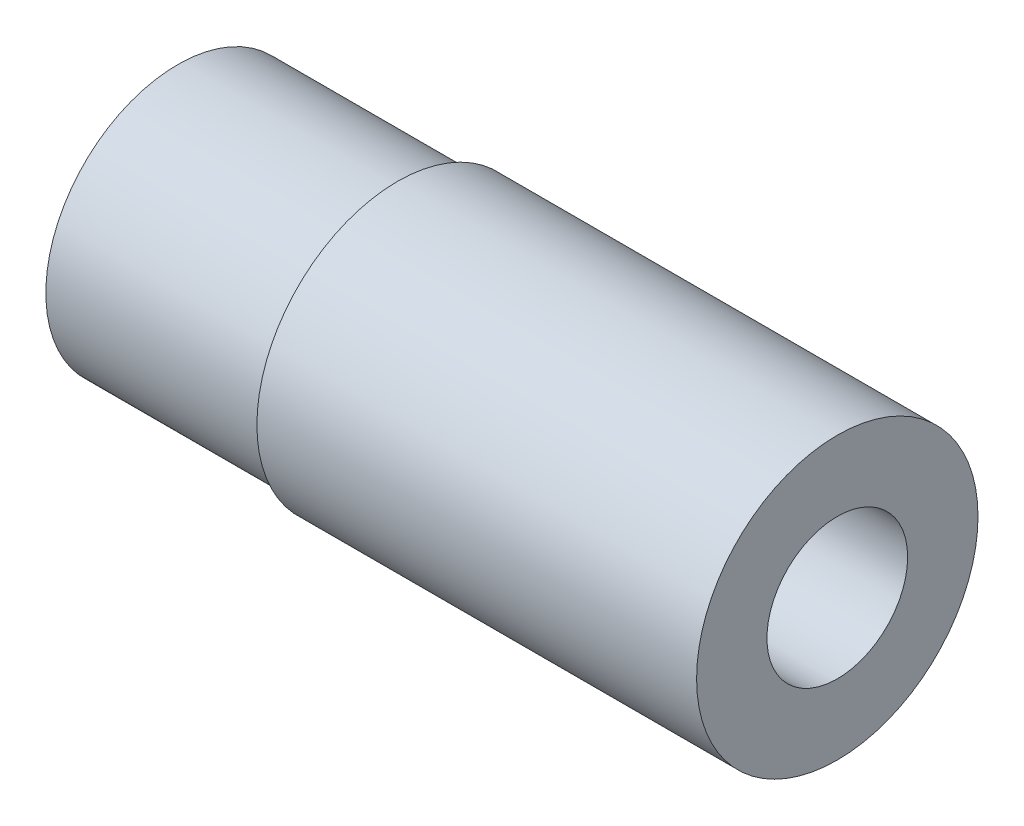
ISO-10303-21;
HEADER;
FILE_DESCRIPTION(('STEP AP214'),'2;1');
FILE_NAME('part.step','',(''),(''),'','','');
FILE_SCHEMA(('AUTOMOTIVE_DESIGN { 1 0 10303 214 1 1 1 1 }'));
ENDSEC;
DATA;
#1=APPLICATION_CONTEXT('core data for automotive mechanical design processes');
#2=APPLICATION_PROTOCOL_DEFINITION('international standard','automotive_design',2000,#1);
#3=PRODUCT_CONTEXT('',#1,'mechanical');
#4=PRODUCT('Part','Part','',(#3));
#5=PRODUCT_RELATED_PRODUCT_CATEGORY('part','',(#4));
#6=PRODUCT_DEFINITION_FORMATION('','',#4);
#7=PRODUCT_DEFINITION_CONTEXT('part definition',#1,'design');
#8=PRODUCT_DEFINITION('design','',#6,#7);
#9=PRODUCT_DEFINITION_SHAPE('','',#8);
#10=(LENGTH_UNIT() NAMED_UNIT(*) SI_UNIT(.MILLI.,.METRE.));
#11=(NAMED_UNIT(*) PLANE_ANGLE_UNIT() SI_UNIT($,.RADIAN.));
#12=(NAMED_UNIT(*) SI_UNIT($,.STERADIAN.) SOLID_ANGLE_UNIT());
#13=UNCERTAINTY_MEASURE_WITH_UNIT(LENGTH_MEASURE(1.E-05),#10,'distance_accuracy_value','');
#14=(GEOMETRIC_REPRESENTATION_CONTEXT(3) GLOBAL_UNCERTAINTY_ASSIGNED_CONTEXT((#13)) GLOBAL_UNIT_ASSIGNED_CONTEXT((#10,
#11,#12)) REPRESENTATION_CONTEXT('',''));
#15=CARTESIAN_POINT('',(0.,0.,0.));
#16=DIRECTION('',(0.,0.,1.));
#17=DIRECTION('',(1.,0.,0.));
#18=AXIS2_PLACEMENT_3D('',#15,#16,#17);
#19=CARTESIAN_POINT('',(0.,0.,0.));
#20=DIRECTION('',(1.,0.,0.));
#21=DIRECTION('',(0.,0.,-1.));
#22=AXIS2_PLACEMENT_3D('',#19,#20,#21);
#23=PLANE('',#22);
#24=CARTESIAN_POINT('',(0.,0.,0.));
#25=DIRECTION('',(1.,0.,0.));
#26=DIRECTION('',(0.,0.,-1.));
#27=AXIS2_PLACEMENT_3D('',#24,#25,#26);
#28=CIRCLE('',#27,15.);
#29=CARTESIAN_POINT('',(0.,0.,-15.));
#30=VERTEX_POINT('',#29);
#31=EDGE_CURVE('E41',#30,#30,#28,.T.);
#32=ORIENTED_EDGE('',*,*,#31,.F.);
#33=EDGE_LOOP('',(#32));
#34=FACE_BOUND('',#33,.T.);
#35=CARTESIAN_POINT('',(0.,0.,0.));
#36=DIRECTION('',(1.,0.,0.));
#37=DIRECTION('',(0.,0.,-1.));
#38=AXIS2_PLACEMENT_3D('',#35,#36,#37);
#39=CIRCLE('',#38,12.);
#40=CARTESIAN_POINT('',(0.,0.,-12.));
#41=VERTEX_POINT('',#40);
#42=EDGE_CURVE('E50',#41,#41,#39,.T.);
#43=ORIENTED_EDGE('',*,*,#42,.T.);
#44=EDGE_LOOP('',(#43));
#45=FACE_BOUND('',#44,.T.);
#46=ADVANCED_FACE('F37',(#34,#45),#23,.F.);
#47=CARTESIAN_POINT('',(25.,0.,0.));
#48=DIRECTION('',(-1.,0.,0.));
#49=DIRECTION('',(0.,0.,1.));
#50=AXIS2_PLACEMENT_3D('',#47,#48,#49);
#51=CYLINDRICAL_SURFACE('',#50,15.);
#52=CARTESIAN_POINT('',(25.,0.,0.));
#53=DIRECTION('',(1.,0.,0.));
#54=DIRECTION('',(0.,0.,-1.));
#55=AXIS2_PLACEMENT_3D('',#52,#53,#54);
#56=CIRCLE('',#55,15.);
#57=CARTESIAN_POINT('',(25.,0.,-15.));
#58=VERTEX_POINT('',#57);
#59=EDGE_CURVE('E10',#58,#58,#56,.T.);
#60=ORIENTED_EDGE('',*,*,#59,.F.);
#61=EDGE_LOOP('',(#60));
#62=FACE_BOUND('',#61,.T.);
#63=ORIENTED_EDGE('',*,*,#31,.T.);
#64=EDGE_LOOP('',(#63));
#65=FACE_BOUND('',#64,.T.);
#66=ADVANCED_FACE('F39',(#62,#65),#51,.T.);
#67=CARTESIAN_POINT('',(25.,0.,0.));
#68=DIRECTION('',(-1.,0.,0.));
#69=DIRECTION('',(0.,0.,1.));
#70=AXIS2_PLACEMENT_3D('',#67,#68,#69);
#71=CYLINDRICAL_SURFACE('',#70,12.);
#72=CARTESIAN_POINT('',(25.,0.,0.));
#73=DIRECTION('',(1.,0.,0.));
#74=DIRECTION('',(0.,0.,-1.));
#75=AXIS2_PLACEMENT_3D('',#72,#73,#74);
#76=CIRCLE('',#75,12.);
#77=CARTESIAN_POINT('',(25.,0.,-12.));
#78=VERTEX_POINT('',#77);
#79=EDGE_CURVE('E55',#78,#78,#76,.T.);
#80=ORIENTED_EDGE('',*,*,#79,.T.);
#81=EDGE_LOOP('',(#80));
#82=FACE_BOUND('',#81,.T.);
#83=ORIENTED_EDGE('',*,*,#42,.F.);
#84=EDGE_LOOP('',(#83));
#85=FACE_BOUND('',#84,.T.);
#86=ADVANCED_FACE('F91',(#82,#85),#71,.F.);
#87=CARTESIAN_POINT('',(25.,0.,0.));
#88=DIRECTION('',(1.,0.,0.));
#89=DIRECTION('',(0.,0.,-1.));
#90=AXIS2_PLACEMENT_3D('',#87,#88,#89);
#91=PLANE('',#90);
#92=CARTESIAN_POINT('',(25.,0.,0.));
#93=DIRECTION('',(1.,0.,0.));
#94=DIRECTION('',(0.,0.,-1.));
#95=AXIS2_PLACEMENT_3D('',#92,#93,#94);
#96=CIRCLE('',#95,8.);
#97=CARTESIAN_POINT('',(25.,0.,-8.));
#98=VERTEX_POINT('',#97);
#99=EDGE_CURVE('E68',#98,#98,#96,.T.);
#100=ORIENTED_EDGE('',*,*,#99,.T.);
#101=EDGE_LOOP('',(#100));
#102=FACE_BOUND('',#101,.T.);
#103=ORIENTED_EDGE('',*,*,#79,.F.);
#104=EDGE_LOOP('',(#103));
#105=FACE_BOUND('',#104,.T.);
#106=ADVANCED_FACE('F82',(#102,#105),#91,.F.);
#107=CARTESIAN_POINT('',(75.,0.,0.));
#108=DIRECTION('',(1.,0.,0.));
#109=DIRECTION('',(0.,0.,-1.));
#110=AXIS2_PLACEMENT_3D('',#107,#108,#109);
#111=PLANE('',#110);
#112=CARTESIAN_POINT('',(75.,0.,0.));
#113=DIRECTION('',(1.,0.,0.));
#114=DIRECTION('',(0.,0.,-1.));
#115=AXIS2_PLACEMENT_3D('',#112,#113,#114);
#116=CIRCLE('',#115,16.);
#117=CARTESIAN_POINT('',(75.,0.,-16.));
#118=VERTEX_POINT('',#117);
#119=EDGE_CURVE('E59',#118,#118,#116,.T.);
#120=ORIENTED_EDGE('',*,*,#119,.T.);
#121=EDGE_LOOP('',(#120));
#122=FACE_BOUND('',#121,.T.);
#123=CARTESIAN_POINT('',(75.,0.,0.));
#124=DIRECTION('',(1.,0.,0.));
#125=DIRECTION('',(0.,0.,-1.));
#126=AXIS2_PLACEMENT_3D('',#123,#124,#125);
#127=CIRCLE('',#126,8.);
#128=CARTESIAN_POINT('',(75.,0.,-8.));
#129=VERTEX_POINT('',#128);
#130=EDGE_CURVE('E64',#129,#129,#127,.T.);
#131=ORIENTED_EDGE('',*,*,#130,.F.);
#132=EDGE_LOOP('',(#131));
#133=FACE_BOUND('',#132,.T.);
#134=ADVANCED_FACE('F79',(#122,#133),#111,.T.);
#135=ORIENTED_EDGE('',*,*,#59,.T.);
#136=EDGE_LOOP('',(#135));
#137=FACE_BOUND('',#136,.T.);
#138=CARTESIAN_POINT('',(25.,0.,0.));
#139=DIRECTION('',(1.,0.,0.));
#140=DIRECTION('',(0.,0.,-1.));
#141=AXIS2_PLACEMENT_3D('',#138,#139,#140);
#142=CIRCLE('',#141,16.);
#143=CARTESIAN_POINT('',(25.,0.,-16.));
#144=VERTEX_POINT('',#143);
#145=EDGE_CURVE('E60',#144,#144,#142,.T.);
#146=ORIENTED_EDGE('',*,*,#145,.F.);
#147=EDGE_LOOP('',(#146));
#148=FACE_BOUND('',#147,.T.);
#149=ADVANCED_FACE('F81',(#137,#148),#91,.F.);
#150=CARTESIAN_POINT('',(75.,0.,0.));
#151=DIRECTION('',(-1.,0.,0.));
#152=DIRECTION('',(0.,0.,1.));
#153=AXIS2_PLACEMENT_3D('',#150,#151,#152);
#154=CYLINDRICAL_SURFACE('',#153,16.);
#155=ORIENTED_EDGE('',*,*,#119,.F.);
#156=EDGE_LOOP('',(#155));
#157=FACE_BOUND('',#156,.T.);
#158=ORIENTED_EDGE('',*,*,#145,.T.);
#159=EDGE_LOOP('',(#158));
#160=FACE_BOUND('',#159,.T.);
#161=ADVANCED_FACE('F89',(#157,#160),#154,.T.);
#162=CARTESIAN_POINT('',(75.,0.,0.));
#163=DIRECTION('',(-1.,0.,0.));
#164=DIRECTION('',(0.,0.,1.));
#165=AXIS2_PLACEMENT_3D('',#162,#163,#164);
#166=CYLINDRICAL_SURFACE('',#165,8.);
#167=ORIENTED_EDGE('',*,*,#130,.T.);
#168=EDGE_LOOP('',(#167));
#169=FACE_BOUND('',#168,.T.);
#170=ORIENTED_EDGE('',*,*,#99,.F.);
#171=EDGE_LOOP('',(#170));
#172=FACE_BOUND('',#171,.T.);
#173=ADVANCED_FACE('F76',(#169,#172),#166,.F.);
#174=CLOSED_SHELL('',(#46,#66,#86,#106,#134,#149,#161,#173));
#175=MANIFOLD_SOLID_BREP('B2',#174);
#176=ADVANCED_BREP_SHAPE_REPRESENTATION('',(#18,#175),#14);
#177=SHAPE_DEFINITION_REPRESENTATION(#9,#176);
ENDSEC;
END-ISO-10303-21;
